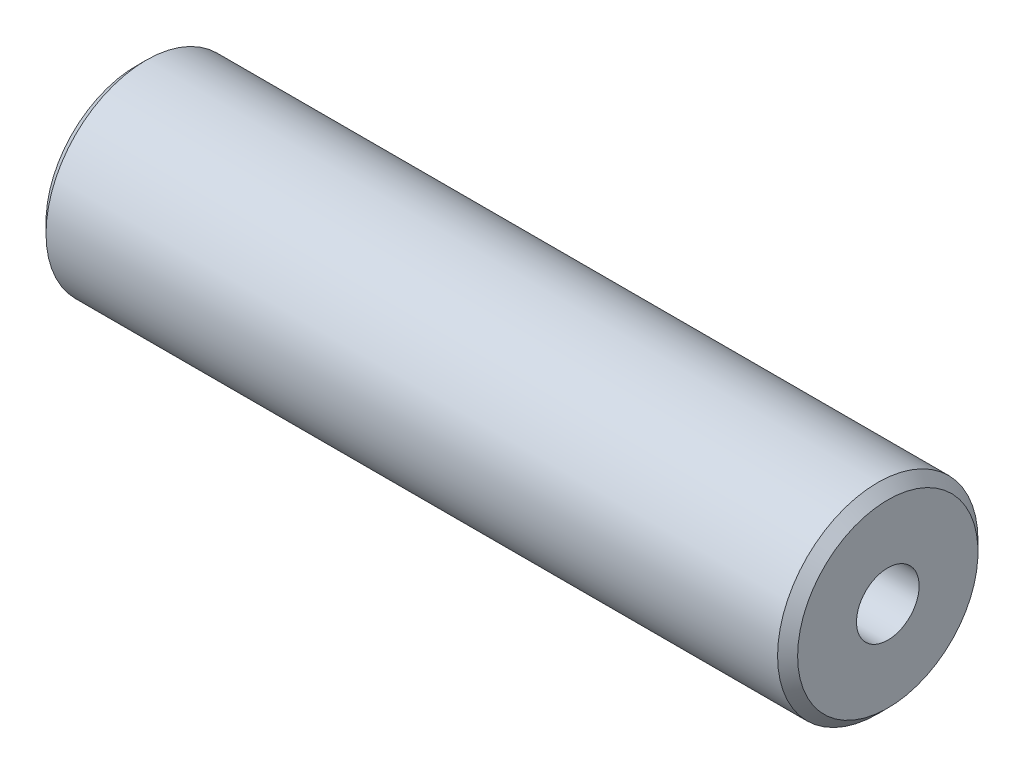
ISO-10303-21;
HEADER;
FILE_DESCRIPTION(('STEP AP214'),'2;1');
FILE_NAME('part.step','',(''),(''),'','','');
FILE_SCHEMA(('AUTOMOTIVE_DESIGN { 1 0 10303 214 1 1 1 1 }'));
ENDSEC;
DATA;
#1=APPLICATION_CONTEXT('core data for automotive mechanical design processes');
#2=APPLICATION_PROTOCOL_DEFINITION('international standard','automotive_design',2000,#1);
#3=PRODUCT_CONTEXT('',#1,'mechanical');
#4=PRODUCT('Part','Part','',(#3));
#5=PRODUCT_RELATED_PRODUCT_CATEGORY('part','',(#4));
#6=PRODUCT_DEFINITION_FORMATION('','',#4);
#7=PRODUCT_DEFINITION_CONTEXT('part definition',#1,'design');
#8=PRODUCT_DEFINITION('design','',#6,#7);
#9=PRODUCT_DEFINITION_SHAPE('','',#8);
#10=(LENGTH_UNIT() NAMED_UNIT(*) SI_UNIT(.MILLI.,.METRE.));
#11=(NAMED_UNIT(*) PLANE_ANGLE_UNIT() SI_UNIT($,.RADIAN.));
#12=(NAMED_UNIT(*) SI_UNIT($,.STERADIAN.) SOLID_ANGLE_UNIT());
#13=UNCERTAINTY_MEASURE_WITH_UNIT(LENGTH_MEASURE(1.E-05),#10,'distance_accuracy_value','');
#14=(GEOMETRIC_REPRESENTATION_CONTEXT(3) GLOBAL_UNCERTAINTY_ASSIGNED_CONTEXT((#13)) GLOBAL_UNIT_ASSIGNED_CONTEXT((#10,
#11,#12)) REPRESENTATION_CONTEXT('',''));
#15=CARTESIAN_POINT('',(0.,0.,0.));
#16=DIRECTION('',(0.,0.,1.));
#17=DIRECTION('',(1.,0.,0.));
#18=AXIS2_PLACEMENT_3D('',#15,#16,#17);
#19=CARTESIAN_POINT('',(0.,4.,0.));
#20=DIRECTION('',(1.,0.,0.));
#21=DIRECTION('',(0.,0.,-1.));
#22=AXIS2_PLACEMENT_3D('',#19,#20,#21);
#23=PLANE('',#22);
#24=CARTESIAN_POINT('',(0.,0.,0.));
#25=DIRECTION('',(-1.,0.,0.));
#26=DIRECTION('',(0.,0.,1.));
#27=AXIS2_PLACEMENT_3D('',#24,#25,#26);
#28=CIRCLE('',#27,1.25);
#29=CARTESIAN_POINT('',(0.,0.,1.25));
#30=VERTEX_POINT('',#29);
#31=EDGE_CURVE('E63',#30,#30,#28,.T.);
#32=ORIENTED_EDGE('',*,*,#31,.F.);
#33=EDGE_LOOP('',(#32));
#34=FACE_BOUND('',#33,.T.);
#35=CARTESIAN_POINT('',(0.,0.,0.));
#36=DIRECTION('',(1.,0.,0.));
#37=DIRECTION('',(0.,0.,-1.));
#38=AXIS2_PLACEMENT_3D('',#35,#36,#37);
#39=CIRCLE('',#38,3.60000000000001);
#40=CARTESIAN_POINT('',(0.,0.,-3.60000000000001));
#41=VERTEX_POINT('',#40);
#42=EDGE_CURVE('E11',#41,#41,#39,.F.);
#43=ORIENTED_EDGE('',*,*,#42,.T.);
#44=EDGE_LOOP('',(#43));
#45=FACE_BOUND('',#44,.T.);
#46=ADVANCED_FACE('F37',(#34,#45),#23,.F.);
#47=CARTESIAN_POINT('',(30.,4.,0.));
#48=DIRECTION('',(-1.,0.,0.));
#49=DIRECTION('',(0.,0.,1.));
#50=AXIS2_PLACEMENT_3D('',#47,#48,#49);
#51=PLANE('',#50);
#52=CARTESIAN_POINT('',(30.,0.,0.));
#53=DIRECTION('',(1.,0.,0.));
#54=DIRECTION('',(0.,0.,-1.));
#55=AXIS2_PLACEMENT_3D('',#52,#53,#54);
#56=CIRCLE('',#55,1.25);
#57=CARTESIAN_POINT('',(30.,0.,-1.25));
#58=VERTEX_POINT('',#57);
#59=EDGE_CURVE('E60',#58,#58,#56,.T.);
#60=ORIENTED_EDGE('',*,*,#59,.F.);
#61=EDGE_LOOP('',(#60));
#62=FACE_BOUND('',#61,.T.);
#63=CARTESIAN_POINT('',(30.,0.,0.));
#64=DIRECTION('',(-1.,0.,0.));
#65=DIRECTION('',(0.,0.,1.));
#66=AXIS2_PLACEMENT_3D('',#63,#64,#65);
#67=CIRCLE('',#66,3.6);
#68=CARTESIAN_POINT('',(30.,0.,3.6));
#69=VERTEX_POINT('',#68);
#70=EDGE_CURVE('E45',#69,#69,#67,.F.);
#71=ORIENTED_EDGE('',*,*,#70,.T.);
#72=EDGE_LOOP('',(#71));
#73=FACE_BOUND('',#72,.T.);
#74=ADVANCED_FACE('F79',(#62,#73),#51,.F.);
#75=CARTESIAN_POINT('',(0.,0.,0.));
#76=DIRECTION('',(-1.,0.,0.));
#77=DIRECTION('',(0.,0.,1.));
#78=AXIS2_PLACEMENT_3D('',#75,#76,#77);
#79=CYLINDRICAL_SURFACE('',#78,4.);
#80=CARTESIAN_POINT('',(29.6,0.,0.));
#81=DIRECTION('',(-1.,0.,0.));
#82=DIRECTION('',(0.,0.,1.));
#83=AXIS2_PLACEMENT_3D('',#80,#81,#82);
#84=CIRCLE('',#83,4.);
#85=CARTESIAN_POINT('',(29.6,0.,4.));
#86=VERTEX_POINT('',#85);
#87=EDGE_CURVE('E74',#86,#86,#84,.T.);
#88=ORIENTED_EDGE('',*,*,#87,.T.);
#89=EDGE_LOOP('',(#88));
#90=FACE_BOUND('',#89,.T.);
#91=CARTESIAN_POINT('',(0.399999999999998,0.,0.));
#92=DIRECTION('',(1.,0.,0.));
#93=DIRECTION('',(0.,0.,-1.));
#94=AXIS2_PLACEMENT_3D('',#91,#92,#93);
#95=CIRCLE('',#94,4.);
#96=CARTESIAN_POINT('',(0.399999999999998,0.,-4.));
#97=VERTEX_POINT('',#96);
#98=EDGE_CURVE('E71',#97,#97,#95,.T.);
#99=ORIENTED_EDGE('',*,*,#98,.T.);
#100=EDGE_LOOP('',(#99));
#101=FACE_BOUND('',#100,.T.);
#102=ADVANCED_FACE('F84',(#90,#101),#79,.T.);
#103=CARTESIAN_POINT('',(29.6,0.,0.));
#104=DIRECTION('',(-1.,0.,0.));
#105=DIRECTION('',(0.,0.,1.));
#106=AXIS2_PLACEMENT_3D('',#103,#104,#105);
#107=CONICAL_SURFACE('',#106,4.,0.785398163397448);
#108=ORIENTED_EDGE('',*,*,#70,.F.);
#109=EDGE_LOOP('',(#108));
#110=FACE_BOUND('',#109,.T.);
#111=ORIENTED_EDGE('',*,*,#87,.F.);
#112=EDGE_LOOP('',(#111));
#113=FACE_BOUND('',#112,.T.);
#114=ADVANCED_FACE('F81',(#110,#113),#107,.T.);
#115=CARTESIAN_POINT('',(0.,0.,0.));
#116=DIRECTION('',(1.,0.,0.));
#117=DIRECTION('',(0.,0.,-1.));
#118=AXIS2_PLACEMENT_3D('',#115,#116,#117);
#119=CONICAL_SURFACE('',#118,3.60000000000001,0.785398163397444);
#120=ORIENTED_EDGE('',*,*,#98,.F.);
#121=EDGE_LOOP('',(#120));
#122=FACE_BOUND('',#121,.T.);
#123=ORIENTED_EDGE('',*,*,#42,.F.);
#124=EDGE_LOOP('',(#123));
#125=FACE_BOUND('',#124,.T.);
#126=ADVANCED_FACE('F39',(#122,#125),#119,.T.);
#127=CARTESIAN_POINT('',(8.5,0.,0.));
#128=DIRECTION('',(-1.,0.,0.));
#129=DIRECTION('',(0.,0.,1.));
#130=AXIS2_PLACEMENT_3D('',#127,#128,#129);
#131=CONICAL_SURFACE('',#130,1.25,1.02974425867665);
#132=CARTESIAN_POINT('',(9.25107577378445,0.,0.));
#133=VERTEX_POINT('',#132);
#134=VERTEX_LOOP('',#133);
#135=FACE_BOUND('',#134,.T.);
#136=CARTESIAN_POINT('',(8.5,0.,0.));
#137=DIRECTION('',(-1.,0.,0.));
#138=DIRECTION('',(0.,0.,1.));
#139=AXIS2_PLACEMENT_3D('',#136,#137,#138);
#140=CIRCLE('',#139,1.25);
#141=CARTESIAN_POINT('',(8.5,0.,1.25));
#142=VERTEX_POINT('',#141);
#143=EDGE_CURVE('E68',#142,#142,#140,.T.);
#144=ORIENTED_EDGE('',*,*,#143,.T.);
#145=EDGE_LOOP('',(#144));
#146=FACE_BOUND('',#145,.T.);
#147=ADVANCED_FACE('F94',(#135,#146),#131,.F.);
#148=CARTESIAN_POINT('',(0.,0.,0.));
#149=DIRECTION('',(-1.,0.,0.));
#150=DIRECTION('',(0.,0.,1.));
#151=AXIS2_PLACEMENT_3D('',#148,#149,#150);
#152=CYLINDRICAL_SURFACE('',#151,1.25);
#153=ORIENTED_EDGE('',*,*,#143,.F.);
#154=EDGE_LOOP('',(#153));
#155=FACE_BOUND('',#154,.T.);
#156=ORIENTED_EDGE('',*,*,#31,.T.);
#157=EDGE_LOOP('',(#156));
#158=FACE_BOUND('',#157,.T.);
#159=ADVANCED_FACE('F111',(#155,#158),#152,.F.);
#160=CARTESIAN_POINT('',(30.,0.,0.));
#161=DIRECTION('',(1.,0.,0.));
#162=DIRECTION('',(0.,0.,-1.));
#163=AXIS2_PLACEMENT_3D('',#160,#161,#162);
#164=CYLINDRICAL_SURFACE('',#163,1.25);
#165=CARTESIAN_POINT('',(21.5,0.,0.));
#166=DIRECTION('',(1.,0.,0.));
#167=DIRECTION('',(0.,0.,-1.));
#168=AXIS2_PLACEMENT_3D('',#165,#166,#167);
#169=CIRCLE('',#168,1.25);
#170=CARTESIAN_POINT('',(21.5,0.,-1.25));
#171=VERTEX_POINT('',#170);
#172=EDGE_CURVE('E58',#171,#171,#169,.T.);
#173=ORIENTED_EDGE('',*,*,#172,.F.);
#174=EDGE_LOOP('',(#173));
#175=FACE_BOUND('',#174,.T.);
#176=ORIENTED_EDGE('',*,*,#59,.T.);
#177=EDGE_LOOP('',(#176));
#178=FACE_BOUND('',#177,.T.);
#179=ADVANCED_FACE('F54',(#175,#178),#164,.F.);
#180=CARTESIAN_POINT('',(21.5,0.,0.));
#181=DIRECTION('',(1.,0.,0.));
#182=DIRECTION('',(0.,0.,-1.));
#183=AXIS2_PLACEMENT_3D('',#180,#181,#182);
#184=CONICAL_SURFACE('',#183,1.25,1.02974425867665);
#185=CARTESIAN_POINT('',(20.7489242262155,0.,0.));
#186=VERTEX_POINT('',#185);
#187=VERTEX_LOOP('',#186);
#188=FACE_BOUND('',#187,.T.);
#189=ORIENTED_EDGE('',*,*,#172,.T.);
#190=EDGE_LOOP('',(#189));
#191=FACE_BOUND('',#190,.T.);
#192=ADVANCED_FACE('F51',(#188,#191),#184,.F.);
#193=CLOSED_SHELL('',(#46,#74,#102,#114,#126,#147,#159,#179,#192));
#194=MANIFOLD_SOLID_BREP('B2',#193);
#195=ADVANCED_BREP_SHAPE_REPRESENTATION('',(#18,#194),#14);
#196=SHAPE_DEFINITION_REPRESENTATION(#9,#195);
ENDSEC;
END-ISO-10303-21;
